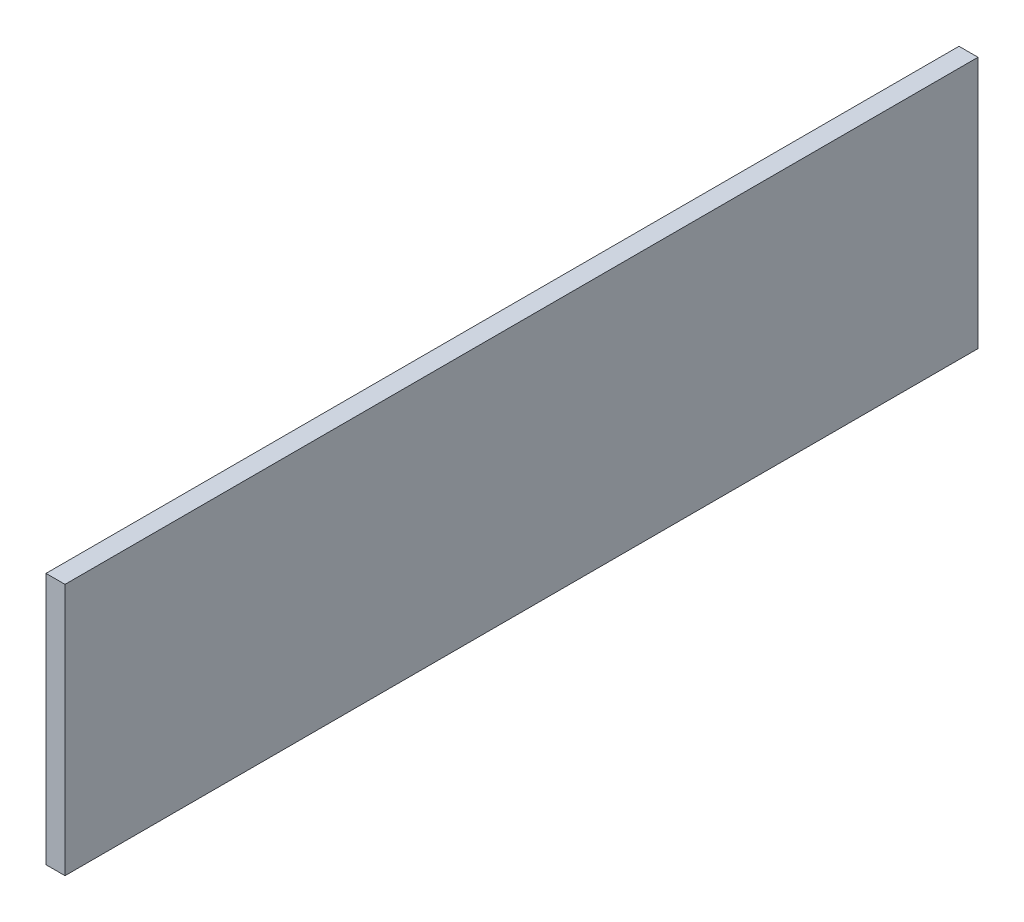
ISO-10303-21;
HEADER;
FILE_DESCRIPTION(('STEP AP214'),'2;1');
FILE_NAME('part.step','',(''),(''),'','','');
FILE_SCHEMA(('AUTOMOTIVE_DESIGN { 1 0 10303 214 1 1 1 1 }'));
ENDSEC;
DATA;
#1=APPLICATION_CONTEXT('core data for automotive mechanical design processes');
#2=APPLICATION_PROTOCOL_DEFINITION('international standard','automotive_design',2000,#1);
#3=PRODUCT_CONTEXT('',#1,'mechanical');
#4=PRODUCT('Part','Part','',(#3));
#5=PRODUCT_RELATED_PRODUCT_CATEGORY('part','',(#4));
#6=PRODUCT_DEFINITION_FORMATION('','',#4);
#7=PRODUCT_DEFINITION_CONTEXT('part definition',#1,'design');
#8=PRODUCT_DEFINITION('design','',#6,#7);
#9=PRODUCT_DEFINITION_SHAPE('','',#8);
#10=(LENGTH_UNIT() NAMED_UNIT(*) SI_UNIT(.MILLI.,.METRE.));
#11=(NAMED_UNIT(*) PLANE_ANGLE_UNIT() SI_UNIT($,.RADIAN.));
#12=(NAMED_UNIT(*) SI_UNIT($,.STERADIAN.) SOLID_ANGLE_UNIT());
#13=UNCERTAINTY_MEASURE_WITH_UNIT(LENGTH_MEASURE(1.E-05),#10,'distance_accuracy_value','');
#14=(GEOMETRIC_REPRESENTATION_CONTEXT(3) GLOBAL_UNCERTAINTY_ASSIGNED_CONTEXT((#13)) GLOBAL_UNIT_ASSIGNED_CONTEXT((#10,
#11,#12)) REPRESENTATION_CONTEXT('',''));
#15=CARTESIAN_POINT('',(0.,0.,0.));
#16=DIRECTION('',(0.,0.,1.));
#17=DIRECTION('',(1.,0.,0.));
#18=AXIS2_PLACEMENT_3D('',#15,#16,#17);
#19=CARTESIAN_POINT('',(-50.546,21.0608333333333,152.4));
#20=DIRECTION('',(1.,0.,0.));
#21=DIRECTION('',(0.,0.,-1.));
#22=AXIS2_PLACEMENT_3D('',#19,#20,#21);
#23=PLANE('',#22);
#24=DIRECTION('',(0.,-1.,0.));
#25=VECTOR('',#24,1.);
#26=CARTESIAN_POINT('',(-50.546,21.0608333333333,0.));
#27=LINE('',#26,#25);
#28=CARTESIAN_POINT('',(-50.546,21.0608333333333,0.));
#29=VERTEX_POINT('',#28);
#30=CARTESIAN_POINT('',(-50.546,-21.0608333333333,0.));
#31=VERTEX_POINT('',#30);
#32=EDGE_CURVE('E107',#29,#31,#27,.T.);
#33=ORIENTED_EDGE('',*,*,#32,.T.);
#34=DIRECTION('',(0.,0.,-1.));
#35=VECTOR('',#34,1.);
#36=CARTESIAN_POINT('',(-50.546,-21.0608333333333,152.4));
#37=LINE('',#36,#35);
#38=CARTESIAN_POINT('',(-50.546,-21.0608333333333,152.4));
#39=VERTEX_POINT('',#38);
#40=EDGE_CURVE('E11',#39,#31,#37,.T.);
#41=ORIENTED_EDGE('',*,*,#40,.F.);
#42=DIRECTION('',(0.,-1.,0.));
#43=VECTOR('',#42,1.);
#44=CARTESIAN_POINT('',(-50.546,21.0608333333333,152.4));
#45=LINE('',#44,#43);
#46=CARTESIAN_POINT('',(-50.546,21.0608333333333,152.4));
#47=VERTEX_POINT('',#46);
#48=EDGE_CURVE('E91',#47,#39,#45,.T.);
#49=ORIENTED_EDGE('',*,*,#48,.F.);
#50=DIRECTION('',(0.,0.,-1.));
#51=VECTOR('',#50,1.);
#52=CARTESIAN_POINT('',(-50.546,21.0608333333333,152.4));
#53=LINE('',#52,#51);
#54=EDGE_CURVE('E103',#47,#29,#53,.T.);
#55=ORIENTED_EDGE('',*,*,#54,.T.);
#56=EDGE_LOOP('',(#33,#41,#49,#55));
#57=FACE_BOUND('',#56,.T.);
#58=ADVANCED_FACE('F39',(#57),#23,.F.);
#59=CARTESIAN_POINT('',(-50.546,-21.0608333333333,152.4));
#60=DIRECTION('',(0.,1.,0.));
#61=DIRECTION('',(0.,0.,1.));
#62=AXIS2_PLACEMENT_3D('',#59,#60,#61);
#63=PLANE('',#62);
#64=DIRECTION('',(1.,0.,0.));
#65=VECTOR('',#64,1.);
#66=CARTESIAN_POINT('',(-50.546,-21.0608333333333,0.));
#67=LINE('',#66,#65);
#68=CARTESIAN_POINT('',(-47.371,-21.0608333333333,0.));
#69=VERTEX_POINT('',#68);
#70=EDGE_CURVE('E96',#31,#69,#67,.T.);
#71=ORIENTED_EDGE('',*,*,#70,.T.);
#72=DIRECTION('',(0.,0.,-1.));
#73=VECTOR('',#72,1.);
#74=CARTESIAN_POINT('',(-47.371,-21.0608333333333,152.4));
#75=LINE('',#74,#73);
#76=CARTESIAN_POINT('',(-47.371,-21.0608333333333,152.4));
#77=VERTEX_POINT('',#76);
#78=EDGE_CURVE('E48',#77,#69,#75,.T.);
#79=ORIENTED_EDGE('',*,*,#78,.F.);
#80=DIRECTION('',(1.,0.,0.));
#81=VECTOR('',#80,1.);
#82=CARTESIAN_POINT('',(-50.546,-21.0608333333333,152.4));
#83=LINE('',#82,#81);
#84=EDGE_CURVE('E86',#39,#77,#83,.T.);
#85=ORIENTED_EDGE('',*,*,#84,.F.);
#86=ORIENTED_EDGE('',*,*,#40,.T.);
#87=EDGE_LOOP('',(#71,#79,#85,#86));
#88=FACE_BOUND('',#87,.T.);
#89=ADVANCED_FACE('F95',(#88),#63,.F.);
#90=CARTESIAN_POINT('',(-47.371,21.0608333333333,152.4));
#91=DIRECTION('',(-1.,0.,0.));
#92=DIRECTION('',(0.,0.,1.));
#93=AXIS2_PLACEMENT_3D('',#90,#91,#92);
#94=PLANE('',#93);
#95=DIRECTION('',(0.,1.,0.));
#96=VECTOR('',#95,1.);
#97=CARTESIAN_POINT('',(-47.371,21.0608333333333,0.));
#98=LINE('',#97,#96);
#99=CARTESIAN_POINT('',(-47.371,21.0608333333333,0.));
#100=VERTEX_POINT('',#99);
#101=EDGE_CURVE('E73',#69,#100,#98,.T.);
#102=ORIENTED_EDGE('',*,*,#101,.T.);
#103=DIRECTION('',(0.,0.,-1.));
#104=VECTOR('',#103,1.);
#105=CARTESIAN_POINT('',(-47.371,21.0608333333333,152.4));
#106=LINE('',#105,#104);
#107=CARTESIAN_POINT('',(-47.371,21.0608333333333,152.4));
#108=VERTEX_POINT('',#107);
#109=EDGE_CURVE('E98',#108,#100,#106,.T.);
#110=ORIENTED_EDGE('',*,*,#109,.F.);
#111=DIRECTION('',(0.,1.,0.));
#112=VECTOR('',#111,1.);
#113=CARTESIAN_POINT('',(-47.371,21.0608333333333,152.4));
#114=LINE('',#113,#112);
#115=EDGE_CURVE('E89',#77,#108,#114,.T.);
#116=ORIENTED_EDGE('',*,*,#115,.F.);
#117=ORIENTED_EDGE('',*,*,#78,.T.);
#118=EDGE_LOOP('',(#102,#110,#116,#117));
#119=FACE_BOUND('',#118,.T.);
#120=ADVANCED_FACE('F99',(#119),#94,.F.);
#121=CARTESIAN_POINT('',(-50.546,21.0608333333333,152.4));
#122=DIRECTION('',(0.,-1.,0.));
#123=DIRECTION('',(0.,0.,-1.));
#124=AXIS2_PLACEMENT_3D('',#121,#122,#123);
#125=PLANE('',#124);
#126=DIRECTION('',(-1.,0.,0.));
#127=VECTOR('',#126,1.);
#128=CARTESIAN_POINT('',(-50.546,21.0608333333333,0.));
#129=LINE('',#128,#127);
#130=EDGE_CURVE('E79',#100,#29,#129,.T.);
#131=ORIENTED_EDGE('',*,*,#130,.T.);
#132=ORIENTED_EDGE('',*,*,#54,.F.);
#133=DIRECTION('',(-1.,0.,0.));
#134=VECTOR('',#133,1.);
#135=CARTESIAN_POINT('',(-50.546,21.0608333333333,152.4));
#136=LINE('',#135,#134);
#137=EDGE_CURVE('E56',#108,#47,#136,.T.);
#138=ORIENTED_EDGE('',*,*,#137,.F.);
#139=ORIENTED_EDGE('',*,*,#109,.T.);
#140=EDGE_LOOP('',(#131,#132,#138,#139));
#141=FACE_BOUND('',#140,.T.);
#142=ADVANCED_FACE('F120',(#141),#125,.F.);
#143=CARTESIAN_POINT('',(0.,0.,152.4));
#144=DIRECTION('',(0.,0.,1.));
#145=DIRECTION('',(1.,0.,0.));
#146=AXIS2_PLACEMENT_3D('',#143,#144,#145);
#147=PLANE('',#146);
#148=ORIENTED_EDGE('',*,*,#48,.T.);
#149=ORIENTED_EDGE('',*,*,#84,.T.);
#150=ORIENTED_EDGE('',*,*,#115,.T.);
#151=ORIENTED_EDGE('',*,*,#137,.T.);
#152=EDGE_LOOP('',(#148,#149,#150,#151));
#153=FACE_BOUND('',#152,.T.);
#154=ADVANCED_FACE('F87',(#153),#147,.T.);
#155=CARTESIAN_POINT('',(0.,0.,0.));
#156=DIRECTION('',(0.,0.,1.));
#157=DIRECTION('',(1.,0.,0.));
#158=AXIS2_PLACEMENT_3D('',#155,#156,#157);
#159=PLANE('',#158);
#160=ORIENTED_EDGE('',*,*,#32,.F.);
#161=ORIENTED_EDGE('',*,*,#130,.F.);
#162=ORIENTED_EDGE('',*,*,#101,.F.);
#163=ORIENTED_EDGE('',*,*,#70,.F.);
#164=EDGE_LOOP('',(#160,#161,#162,#163));
#165=FACE_BOUND('',#164,.T.);
#166=ADVANCED_FACE('F123',(#165),#159,.F.);
#167=CLOSED_SHELL('',(#58,#89,#120,#142,#154,#166));
#168=MANIFOLD_SOLID_BREP('B2',#167);
#169=ADVANCED_BREP_SHAPE_REPRESENTATION('',(#18,#168),#14);
#170=SHAPE_DEFINITION_REPRESENTATION(#9,#169);
ENDSEC;
END-ISO-10303-21;
